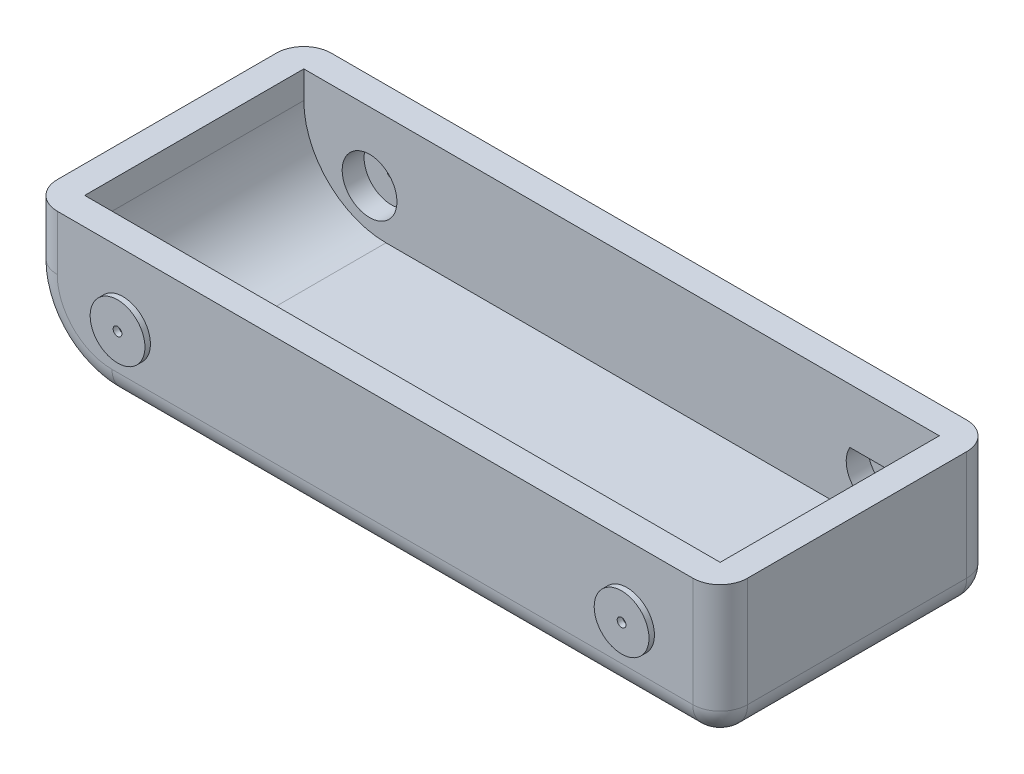
ISO-10303-21;
HEADER;
FILE_DESCRIPTION(('STEP AP214'),'2;1');
FILE_NAME('part.step','',(''),(''),'','','');
FILE_SCHEMA(('AUTOMOTIVE_DESIGN { 1 0 10303 214 1 1 1 1 }'));
ENDSEC;
DATA;
#1=APPLICATION_CONTEXT('core data for automotive mechanical design processes');
#2=APPLICATION_PROTOCOL_DEFINITION('international standard','automotive_design',2000,#1);
#3=PRODUCT_CONTEXT('',#1,'mechanical');
#4=PRODUCT('Part','Part','',(#3));
#5=PRODUCT_RELATED_PRODUCT_CATEGORY('part','',(#4));
#6=PRODUCT_DEFINITION_FORMATION('','',#4);
#7=PRODUCT_DEFINITION_CONTEXT('part definition',#1,'design');
#8=PRODUCT_DEFINITION('design','',#6,#7);
#9=PRODUCT_DEFINITION_SHAPE('','',#8);
#10=(LENGTH_UNIT() NAMED_UNIT(*) SI_UNIT(.MILLI.,.METRE.));
#11=(NAMED_UNIT(*) PLANE_ANGLE_UNIT() SI_UNIT($,.RADIAN.));
#12=(NAMED_UNIT(*) SI_UNIT($,.STERADIAN.) SOLID_ANGLE_UNIT());
#13=UNCERTAINTY_MEASURE_WITH_UNIT(LENGTH_MEASURE(1.E-05),#10,'distance_accuracy_value','');
#14=(GEOMETRIC_REPRESENTATION_CONTEXT(3) GLOBAL_UNCERTAINTY_ASSIGNED_CONTEXT((#13)) GLOBAL_UNIT_ASSIGNED_CONTEXT((#10,
#11,#12)) REPRESENTATION_CONTEXT('',''));
#15=CARTESIAN_POINT('',(0.,0.,0.));
#16=DIRECTION('',(0.,0.,1.));
#17=DIRECTION('',(1.,0.,0.));
#18=AXIS2_PLACEMENT_3D('',#15,#16,#17);
#19=CARTESIAN_POINT('',(0.,25.,0.));
#20=DIRECTION('',(1.,0.,0.));
#21=DIRECTION('',(0.,0.,-1.));
#22=AXIS2_PLACEMENT_3D('',#19,#20,#21);
#23=PLANE('',#22);
#24=DIRECTION('',(0.,0.,1.));
#25=VECTOR('',#24,1.);
#26=CARTESIAN_POINT('',(0.,15.,0.));
#27=LINE('',#26,#25);
#28=CARTESIAN_POINT('',(0.,15.,-45.));
#29=VERTEX_POINT('',#28);
#30=CARTESIAN_POINT('',(0.,15.,-5.));
#31=VERTEX_POINT('',#30);
#32=EDGE_CURVE('E274',#29,#31,#27,.T.);
#33=ORIENTED_EDGE('',*,*,#32,.T.);
#34=DIRECTION('',(0.,-1.,0.));
#35=VECTOR('',#34,1.);
#36=CARTESIAN_POINT('',(0.,25.,-5.));
#37=LINE('',#36,#35);
#38=CARTESIAN_POINT('',(0.,25.,-5.));
#39=VERTEX_POINT('',#38);
#40=EDGE_CURVE('E229',#31,#39,#37,.F.);
#41=ORIENTED_EDGE('',*,*,#40,.T.);
#42=DIRECTION('',(0.,0.,1.));
#43=VECTOR('',#42,1.);
#44=CARTESIAN_POINT('',(0.,25.,0.));
#45=LINE('',#44,#43);
#46=CARTESIAN_POINT('',(0.,25.,-45.));
#47=VERTEX_POINT('',#46);
#48=EDGE_CURVE('E282',#47,#39,#45,.T.);
#49=ORIENTED_EDGE('',*,*,#48,.F.);
#50=DIRECTION('',(0.,-1.,0.));
#51=VECTOR('',#50,1.);
#52=CARTESIAN_POINT('',(0.,25.,-45.));
#53=LINE('',#52,#51);
#54=EDGE_CURVE('E224',#47,#29,#53,.T.);
#55=ORIENTED_EDGE('',*,*,#54,.T.);
#56=EDGE_LOOP('',(#33,#41,#49,#55));
#57=FACE_BOUND('',#56,.T.);
#58=ADVANCED_FACE('F48',(#57),#23,.F.);
#59=CARTESIAN_POINT('',(0.,25.,0.));
#60=DIRECTION('',(0.,0.,-1.));
#61=DIRECTION('',(-1.,0.,0.));
#62=AXIS2_PLACEMENT_3D('',#59,#60,#61);
#63=PLANE('',#62);
#64=CARTESIAN_POINT('',(109.,12.5,0.));
#65=DIRECTION('',(0.,0.,-1.));
#66=DIRECTION('',(-1.,0.,0.));
#67=AXIS2_PLACEMENT_3D('',#64,#65,#66);
#68=CIRCLE('',#67,5.);
#69=CARTESIAN_POINT('',(104.,12.5,0.));
#70=VERTEX_POINT('',#69);
#71=EDGE_CURVE('E52',#70,#70,#68,.F.);
#72=ORIENTED_EDGE('',*,*,#71,.F.);
#73=EDGE_LOOP('',(#72));
#74=FACE_BOUND('',#73,.T.);
#75=CARTESIAN_POINT('',(17.,12.5,0.));
#76=DIRECTION('',(0.,0.,-1.));
#77=DIRECTION('',(-1.,0.,0.));
#78=AXIS2_PLACEMENT_3D('',#75,#76,#77);
#79=CIRCLE('',#78,5.);
#80=CARTESIAN_POINT('',(12.,12.5,0.));
#81=VERTEX_POINT('',#80);
#82=EDGE_CURVE('E58',#81,#81,#79,.F.);
#83=ORIENTED_EDGE('',*,*,#82,.F.);
#84=EDGE_LOOP('',(#83));
#85=FACE_BOUND('',#84,.T.);
#86=DIRECTION('',(1.,0.,0.));
#87=VECTOR('',#86,1.);
#88=CARTESIAN_POINT('',(0.,25.,0.));
#89=LINE('',#88,#87);
#90=CARTESIAN_POINT('',(5.,25.,0.));
#91=VERTEX_POINT('',#90);
#92=CARTESIAN_POINT('',(121.,25.,0.));
#93=VERTEX_POINT('',#92);
#94=EDGE_CURVE('E211',#91,#93,#89,.T.);
#95=ORIENTED_EDGE('',*,*,#94,.F.);
#96=DIRECTION('',(0.,-1.,0.));
#97=VECTOR('',#96,1.);
#98=CARTESIAN_POINT('',(5.,25.,0.));
#99=LINE('',#98,#97);
#100=CARTESIAN_POINT('',(5.,15.,0.));
#101=VERTEX_POINT('',#100);
#102=EDGE_CURVE('E212',#91,#101,#99,.T.);
#103=ORIENTED_EDGE('',*,*,#102,.T.);
#104=CARTESIAN_POINT('',(15.,15.,0.));
#105=DIRECTION('',(0.,0.,-1.));
#106=DIRECTION('',(-1.,0.,0.));
#107=AXIS2_PLACEMENT_3D('',#104,#105,#106);
#108=CIRCLE('',#107,10.);
#109=CARTESIAN_POINT('',(15.,5.,0.));
#110=VERTEX_POINT('',#109);
#111=EDGE_CURVE('E223',#101,#110,#108,.F.);
#112=ORIENTED_EDGE('',*,*,#111,.T.);
#113=DIRECTION('',(1.,0.,0.));
#114=VECTOR('',#113,1.);
#115=CARTESIAN_POINT('',(121.,5.,0.));
#116=LINE('',#115,#114);
#117=CARTESIAN_POINT('',(121.,5.,0.));
#118=VERTEX_POINT('',#117);
#119=EDGE_CURVE('E226',#110,#118,#116,.T.);
#120=ORIENTED_EDGE('',*,*,#119,.T.);
#121=DIRECTION('',(0.,-1.,0.));
#122=VECTOR('',#121,1.);
#123=CARTESIAN_POINT('',(121.,25.,0.));
#124=LINE('',#123,#122);
#125=EDGE_CURVE('E214',#118,#93,#124,.F.);
#126=ORIENTED_EDGE('',*,*,#125,.T.);
#127=EDGE_LOOP('',(#95,#103,#112,#120,#126));
#128=FACE_BOUND('',#127,.T.);
#129=ADVANCED_FACE('F202',(#74,#85,#128),#63,.F.);
#130=CARTESIAN_POINT('',(126.,25.,0.));
#131=DIRECTION('',(-1.,0.,0.));
#132=DIRECTION('',(0.,0.,1.));
#133=AXIS2_PLACEMENT_3D('',#130,#131,#132);
#134=PLANE('',#133);
#135=DIRECTION('',(0.,-1.,0.));
#136=VECTOR('',#135,1.);
#137=CARTESIAN_POINT('',(126.,25.,-5.));
#138=LINE('',#137,#136);
#139=CARTESIAN_POINT('',(126.,25.,-5.));
#140=VERTEX_POINT('',#139);
#141=CARTESIAN_POINT('',(126.,5.,-5.));
#142=VERTEX_POINT('',#141);
#143=EDGE_CURVE('E235',#140,#142,#138,.T.);
#144=ORIENTED_EDGE('',*,*,#143,.T.);
#145=DIRECTION('',(0.,0.,-1.));
#146=VECTOR('',#145,1.);
#147=CARTESIAN_POINT('',(126.,5.,-45.));
#148=LINE('',#147,#146);
#149=CARTESIAN_POINT('',(126.,5.,-45.));
#150=VERTEX_POINT('',#149);
#151=EDGE_CURVE('E244',#142,#150,#148,.T.);
#152=ORIENTED_EDGE('',*,*,#151,.T.);
#153=DIRECTION('',(0.,-1.,0.));
#154=VECTOR('',#153,1.);
#155=CARTESIAN_POINT('',(126.,25.,-45.));
#156=LINE('',#155,#154);
#157=CARTESIAN_POINT('',(126.,25.,-45.));
#158=VERTEX_POINT('',#157);
#159=EDGE_CURVE('E241',#150,#158,#156,.F.);
#160=ORIENTED_EDGE('',*,*,#159,.T.);
#161=DIRECTION('',(0.,0.,-1.));
#162=VECTOR('',#161,1.);
#163=CARTESIAN_POINT('',(126.,25.,0.));
#164=LINE('',#163,#162);
#165=EDGE_CURVE('E239',#140,#158,#164,.T.);
#166=ORIENTED_EDGE('',*,*,#165,.F.);
#167=EDGE_LOOP('',(#144,#152,#160,#166));
#168=FACE_BOUND('',#167,.T.);
#169=ADVANCED_FACE('F205',(#168),#134,.F.);
#170=CARTESIAN_POINT('',(0.,25.,-50.));
#171=DIRECTION('',(0.,0.,1.));
#172=DIRECTION('',(1.,0.,0.));
#173=AXIS2_PLACEMENT_3D('',#170,#171,#172);
#174=PLANE('',#173);
#175=CARTESIAN_POINT('',(17.,12.5,-50.));
#176=DIRECTION('',(0.,0.,1.));
#177=DIRECTION('',(1.,0.,0.));
#178=AXIS2_PLACEMENT_3D('',#175,#176,#177);
#179=CIRCLE('',#178,5.);
#180=CARTESIAN_POINT('',(22.,12.5,-50.));
#181=VERTEX_POINT('',#180);
#182=EDGE_CURVE('E178',#181,#181,#179,.F.);
#183=ORIENTED_EDGE('',*,*,#182,.F.);
#184=EDGE_LOOP('',(#183));
#185=FACE_BOUND('',#184,.T.);
#186=CARTESIAN_POINT('',(109.,12.5,-50.));
#187=DIRECTION('',(0.,0.,1.));
#188=DIRECTION('',(1.,0.,0.));
#189=AXIS2_PLACEMENT_3D('',#186,#187,#188);
#190=CIRCLE('',#189,5.);
#191=CARTESIAN_POINT('',(114.,12.5,-50.));
#192=VERTEX_POINT('',#191);
#193=EDGE_CURVE('E166',#192,#192,#190,.F.);
#194=ORIENTED_EDGE('',*,*,#193,.F.);
#195=EDGE_LOOP('',(#194));
#196=FACE_BOUND('',#195,.T.);
#197=CARTESIAN_POINT('',(15.,15.,-50.));
#198=DIRECTION('',(0.,0.,1.));
#199=DIRECTION('',(1.,0.,0.));
#200=AXIS2_PLACEMENT_3D('',#197,#198,#199);
#201=CIRCLE('',#200,10.);
#202=CARTESIAN_POINT('',(15.,5.,-50.));
#203=VERTEX_POINT('',#202);
#204=CARTESIAN_POINT('',(5.,15.,-50.));
#205=VERTEX_POINT('',#204);
#206=EDGE_CURVE('E243',#203,#205,#201,.F.);
#207=ORIENTED_EDGE('',*,*,#206,.T.);
#208=DIRECTION('',(0.,-1.,0.));
#209=VECTOR('',#208,1.);
#210=CARTESIAN_POINT('',(5.,25.,-50.));
#211=LINE('',#210,#209);
#212=CARTESIAN_POINT('',(5.,25.,-50.));
#213=VERTEX_POINT('',#212);
#214=EDGE_CURVE('E251',#205,#213,#211,.F.);
#215=ORIENTED_EDGE('',*,*,#214,.T.);
#216=DIRECTION('',(-1.,0.,0.));
#217=VECTOR('',#216,1.);
#218=CARTESIAN_POINT('',(0.,25.,-50.));
#219=LINE('',#218,#217);
#220=CARTESIAN_POINT('',(121.,25.,-50.));
#221=VERTEX_POINT('',#220);
#222=EDGE_CURVE('E238',#221,#213,#219,.T.);
#223=ORIENTED_EDGE('',*,*,#222,.F.);
#224=DIRECTION('',(0.,-1.,0.));
#225=VECTOR('',#224,1.);
#226=CARTESIAN_POINT('',(121.,25.,-50.));
#227=LINE('',#226,#225);
#228=CARTESIAN_POINT('',(121.,5.,-50.));
#229=VERTEX_POINT('',#228);
#230=EDGE_CURVE('E247',#221,#229,#227,.T.);
#231=ORIENTED_EDGE('',*,*,#230,.T.);
#232=DIRECTION('',(-1.,0.,0.));
#233=VECTOR('',#232,1.);
#234=CARTESIAN_POINT('',(15.,5.,-50.));
#235=LINE('',#234,#233);
#236=EDGE_CURVE('E250',#229,#203,#235,.T.);
#237=ORIENTED_EDGE('',*,*,#236,.T.);
#238=EDGE_LOOP('',(#207,#215,#223,#231,#237));
#239=FACE_BOUND('',#238,.T.);
#240=ADVANCED_FACE('F367',(#185,#196,#239),#174,.F.);
#241=CARTESIAN_POINT('',(0.,25.,0.));
#242=DIRECTION('',(0.,-1.,0.));
#243=DIRECTION('',(0.,0.,-1.));
#244=AXIS2_PLACEMENT_3D('',#241,#242,#243);
#245=PLANE('',#244);
#246=DIRECTION('',(1.,0.,0.));
#247=VECTOR('',#246,1.);
#248=CARTESIAN_POINT('',(5.00000000000001,25.,-5.));
#249=LINE('',#248,#247);
#250=CARTESIAN_POINT('',(5.00000000000001,25.,-5.));
#251=VERTEX_POINT('',#250);
#252=CARTESIAN_POINT('',(121.,25.,-5.));
#253=VERTEX_POINT('',#252);
#254=EDGE_CURVE('E286',#251,#253,#249,.T.);
#255=ORIENTED_EDGE('',*,*,#254,.F.);
#256=DIRECTION('',(0.,0.,1.));
#257=VECTOR('',#256,1.);
#258=CARTESIAN_POINT('',(5.,25.,-45.));
#259=LINE('',#258,#257);
#260=CARTESIAN_POINT('',(5.,25.,-45.));
#261=VERTEX_POINT('',#260);
#262=EDGE_CURVE('E292',#261,#251,#259,.T.);
#263=ORIENTED_EDGE('',*,*,#262,.F.);
#264=DIRECTION('',(-1.,0.,0.));
#265=VECTOR('',#264,1.);
#266=CARTESIAN_POINT('',(5.,25.,-45.));
#267=LINE('',#266,#265);
#268=CARTESIAN_POINT('',(121.,25.,-45.));
#269=VERTEX_POINT('',#268);
#270=EDGE_CURVE('E290',#269,#261,#267,.T.);
#271=ORIENTED_EDGE('',*,*,#270,.F.);
#272=DIRECTION('',(0.,0.,-1.));
#273=VECTOR('',#272,1.);
#274=CARTESIAN_POINT('',(121.,25.,-45.));
#275=LINE('',#274,#273);
#276=EDGE_CURVE('E288',#253,#269,#275,.T.);
#277=ORIENTED_EDGE('',*,*,#276,.F.);
#278=EDGE_LOOP('',(#255,#263,#271,#277));
#279=FACE_BOUND('',#278,.T.);
#280=ORIENTED_EDGE('',*,*,#48,.T.);
#281=CARTESIAN_POINT('',(5.,25.,-5.));
#282=DIRECTION('',(0.,-1.,0.));
#283=DIRECTION('',(0.,0.,-1.));
#284=AXIS2_PLACEMENT_3D('',#281,#282,#283);
#285=CIRCLE('',#284,5.);
#286=EDGE_CURVE('E218',#39,#91,#285,.F.);
#287=ORIENTED_EDGE('',*,*,#286,.T.);
#288=ORIENTED_EDGE('',*,*,#94,.T.);
#289=CARTESIAN_POINT('',(121.,25.,-5.));
#290=DIRECTION('',(0.,-1.,0.));
#291=DIRECTION('',(0.,0.,-1.));
#292=AXIS2_PLACEMENT_3D('',#289,#290,#291);
#293=CIRCLE('',#292,5.);
#294=EDGE_CURVE('E217',#93,#140,#293,.F.);
#295=ORIENTED_EDGE('',*,*,#294,.T.);
#296=ORIENTED_EDGE('',*,*,#165,.T.);
#297=CARTESIAN_POINT('',(121.,25.,-45.));
#298=DIRECTION('',(0.,-1.,0.));
#299=DIRECTION('',(0.,0.,-1.));
#300=AXIS2_PLACEMENT_3D('',#297,#298,#299);
#301=CIRCLE('',#300,5.);
#302=EDGE_CURVE('E236',#158,#221,#301,.F.);
#303=ORIENTED_EDGE('',*,*,#302,.T.);
#304=ORIENTED_EDGE('',*,*,#222,.T.);
#305=CARTESIAN_POINT('',(5.,25.,-45.));
#306=DIRECTION('',(0.,-1.,0.));
#307=DIRECTION('',(0.,0.,-1.));
#308=AXIS2_PLACEMENT_3D('',#305,#306,#307);
#309=CIRCLE('',#308,5.);
#310=EDGE_CURVE('E279',#213,#47,#309,.F.);
#311=ORIENTED_EDGE('',*,*,#310,.T.);
#312=EDGE_LOOP('',(#280,#287,#288,#295,#296,#303,#304,#311));
#313=FACE_BOUND('',#312,.T.);
#314=ADVANCED_FACE('F345',(#279,#313),#245,.F.);
#315=CARTESIAN_POINT('',(0.,0.,0.));
#316=DIRECTION('',(0.,-1.,0.));
#317=DIRECTION('',(0.,0.,-1.));
#318=AXIS2_PLACEMENT_3D('',#315,#316,#317);
#319=PLANE('',#318);
#320=DIRECTION('',(0.,0.,-1.));
#321=VECTOR('',#320,1.);
#322=CARTESIAN_POINT('',(121.,0.,-5.));
#323=LINE('',#322,#321);
#324=CARTESIAN_POINT('',(121.,0.,-45.));
#325=VERTEX_POINT('',#324);
#326=CARTESIAN_POINT('',(121.,0.,-5.));
#327=VERTEX_POINT('',#326);
#328=EDGE_CURVE('E692',#325,#327,#323,.F.);
#329=ORIENTED_EDGE('',*,*,#328,.T.);
#330=DIRECTION('',(1.,0.,0.));
#331=VECTOR('',#330,1.);
#332=CARTESIAN_POINT('',(15.,0.,-5.));
#333=LINE('',#332,#331);
#334=CARTESIAN_POINT('',(15.,0.,-5.));
#335=VERTEX_POINT('',#334);
#336=EDGE_CURVE('E273',#327,#335,#333,.F.);
#337=ORIENTED_EDGE('',*,*,#336,.T.);
#338=DIRECTION('',(0.,0.,1.));
#339=VECTOR('',#338,1.);
#340=CARTESIAN_POINT('',(15.,0.,-50.));
#341=LINE('',#340,#339);
#342=CARTESIAN_POINT('',(15.,0.,-45.));
#343=VERTEX_POINT('',#342);
#344=EDGE_CURVE('E270',#335,#343,#341,.F.);
#345=ORIENTED_EDGE('',*,*,#344,.T.);
#346=DIRECTION('',(-1.,0.,0.));
#347=VECTOR('',#346,1.);
#348=CARTESIAN_POINT('',(121.,0.,-45.));
#349=LINE('',#348,#347);
#350=EDGE_CURVE('E260',#343,#325,#349,.F.);
#351=ORIENTED_EDGE('',*,*,#350,.T.);
#352=EDGE_LOOP('',(#329,#337,#345,#351));
#353=FACE_BOUND('',#352,.T.);
#354=ADVANCED_FACE('F347',(#353),#319,.T.);
#355=CARTESIAN_POINT('',(5.,5.,-45.));
#356=DIRECTION('',(-1.,0.,0.));
#357=DIRECTION('',(0.,0.,1.));
#358=AXIS2_PLACEMENT_3D('',#355,#356,#357);
#359=PLANE('',#358);
#360=DIRECTION('',(0.,1.,0.));
#361=VECTOR('',#360,1.);
#362=CARTESIAN_POINT('',(5.00000000000001,5.,-5.));
#363=LINE('',#362,#361);
#364=CARTESIAN_POINT('',(5.00000000000001,20.,-5.));
#365=VERTEX_POINT('',#364);
#366=EDGE_CURVE('E263',#365,#251,#363,.T.);
#367=ORIENTED_EDGE('',*,*,#366,.F.);
#368=DIRECTION('',(0.,0.,1.));
#369=VECTOR('',#368,1.);
#370=CARTESIAN_POINT('',(5.,20.,-45.));
#371=LINE('',#370,#369);
#372=CARTESIAN_POINT('',(5.,20.,-45.));
#373=VERTEX_POINT('',#372);
#374=EDGE_CURVE('E257',#365,#373,#371,.F.);
#375=ORIENTED_EDGE('',*,*,#374,.T.);
#376=DIRECTION('',(0.,1.,0.));
#377=VECTOR('',#376,1.);
#378=CARTESIAN_POINT('',(5.,5.,-45.));
#379=LINE('',#378,#377);
#380=EDGE_CURVE('E259',#373,#261,#379,.T.);
#381=ORIENTED_EDGE('',*,*,#380,.T.);
#382=ORIENTED_EDGE('',*,*,#262,.T.);
#383=EDGE_LOOP('',(#367,#375,#381,#382));
#384=FACE_BOUND('',#383,.T.);
#385=ADVANCED_FACE('F319',(#384),#359,.F.);
#386=CARTESIAN_POINT('',(5.,5.,-45.));
#387=DIRECTION('',(0.,0.,-1.));
#388=DIRECTION('',(-1.,0.,0.));
#389=AXIS2_PLACEMENT_3D('',#386,#387,#388);
#390=PLANE('',#389);
#391=CARTESIAN_POINT('',(109.,12.5,-45.));
#392=DIRECTION('',(0.,0.,-1.));
#393=DIRECTION('',(-1.,0.,0.));
#394=AXIS2_PLACEMENT_3D('',#391,#392,#393);
#395=CIRCLE('',#394,5.);
#396=CARTESIAN_POINT('',(113.330127018922,15.,-45.));
#397=VERTEX_POINT('',#396);
#398=CARTESIAN_POINT('',(104.669872981078,15.,-45.));
#399=VERTEX_POINT('',#398);
#400=EDGE_CURVE('E153',#397,#399,#395,.T.);
#401=ORIENTED_EDGE('',*,*,#400,.T.);
#402=DIRECTION('',(-1.,0.,0.));
#403=VECTOR('',#402,1.);
#404=CARTESIAN_POINT('',(0.,15.,-45.));
#405=LINE('',#404,#403);
#406=EDGE_CURVE('E157',#397,#399,#405,.T.);
#407=ORIENTED_EDGE('',*,*,#406,.F.);
#408=EDGE_LOOP('',(#401,#407));
#409=FACE_BOUND('',#408,.T.);
#410=CARTESIAN_POINT('',(17.,12.5,-45.));
#411=DIRECTION('',(0.,0.,-1.));
#412=DIRECTION('',(-1.,0.,0.));
#413=AXIS2_PLACEMENT_3D('',#410,#411,#412);
#414=CIRCLE('',#413,5.);
#415=CARTESIAN_POINT('',(12.,12.5,-45.));
#416=VERTEX_POINT('',#415);
#417=EDGE_CURVE('E187',#416,#416,#414,.F.);
#418=ORIENTED_EDGE('',*,*,#417,.F.);
#419=EDGE_LOOP('',(#418));
#420=FACE_BOUND('',#419,.T.);
#421=ORIENTED_EDGE('',*,*,#380,.F.);
#422=CARTESIAN_POINT('',(20.,20.,-45.));
#423=DIRECTION('',(0.,0.,-1.));
#424=DIRECTION('',(-1.,0.,0.));
#425=AXIS2_PLACEMENT_3D('',#422,#423,#424);
#426=CIRCLE('',#425,15.);
#427=CARTESIAN_POINT('',(20.,5.,-45.));
#428=VERTEX_POINT('',#427);
#429=EDGE_CURVE('E254',#373,#428,#426,.F.);
#430=ORIENTED_EDGE('',*,*,#429,.T.);
#431=DIRECTION('',(-1.,0.,0.));
#432=VECTOR('',#431,1.);
#433=CARTESIAN_POINT('',(5.,5.,-45.));
#434=LINE('',#433,#432);
#435=CARTESIAN_POINT('',(121.,5.,-45.));
#436=VERTEX_POINT('',#435);
#437=EDGE_CURVE('E269',#436,#428,#434,.T.);
#438=ORIENTED_EDGE('',*,*,#437,.F.);
#439=DIRECTION('',(0.,1.,0.));
#440=VECTOR('',#439,1.);
#441=CARTESIAN_POINT('',(121.,5.,-45.));
#442=LINE('',#441,#440);
#443=EDGE_CURVE('E256',#436,#269,#442,.T.);
#444=ORIENTED_EDGE('',*,*,#443,.T.);
#445=ORIENTED_EDGE('',*,*,#270,.T.);
#446=EDGE_LOOP('',(#421,#430,#438,#444,#445));
#447=FACE_BOUND('',#446,.T.);
#448=ADVANCED_FACE('F315',(#409,#420,#447),#390,.F.);
#449=CARTESIAN_POINT('',(121.,5.,-45.));
#450=DIRECTION('',(1.,0.,0.));
#451=DIRECTION('',(0.,0.,-1.));
#452=AXIS2_PLACEMENT_3D('',#449,#450,#451);
#453=PLANE('',#452);
#454=ORIENTED_EDGE('',*,*,#276,.T.);
#455=ORIENTED_EDGE('',*,*,#443,.F.);
#456=DIRECTION('',(0.,0.,-1.));
#457=VECTOR('',#456,1.);
#458=CARTESIAN_POINT('',(121.,5.,-45.));
#459=LINE('',#458,#457);
#460=CARTESIAN_POINT('',(121.,5.,-5.));
#461=VERTEX_POINT('',#460);
#462=EDGE_CURVE('E303',#461,#436,#459,.T.);
#463=ORIENTED_EDGE('',*,*,#462,.F.);
#464=DIRECTION('',(0.,1.,0.));
#465=VECTOR('',#464,1.);
#466=CARTESIAN_POINT('',(121.,5.,-5.));
#467=LINE('',#466,#465);
#468=EDGE_CURVE('E264',#461,#253,#467,.T.);
#469=ORIENTED_EDGE('',*,*,#468,.T.);
#470=EDGE_LOOP('',(#454,#455,#463,#469));
#471=FACE_BOUND('',#470,.T.);
#472=ADVANCED_FACE('F318',(#471),#453,.F.);
#473=CARTESIAN_POINT('',(5.00000000000001,5.,-5.));
#474=DIRECTION('',(0.,0.,1.));
#475=DIRECTION('',(1.,0.,0.));
#476=AXIS2_PLACEMENT_3D('',#473,#474,#475);
#477=PLANE('',#476);
#478=CARTESIAN_POINT('',(109.,12.5,-5.));
#479=DIRECTION('',(0.,0.,-1.));
#480=DIRECTION('',(-1.,0.,0.));
#481=AXIS2_PLACEMENT_3D('',#478,#479,#480);
#482=CIRCLE('',#481,5.);
#483=CARTESIAN_POINT('',(104.,12.5,-5.));
#484=VERTEX_POINT('',#483);
#485=EDGE_CURVE('E194',#484,#484,#482,.T.);
#486=ORIENTED_EDGE('',*,*,#485,.F.);
#487=EDGE_LOOP('',(#486));
#488=FACE_BOUND('',#487,.T.);
#489=CARTESIAN_POINT('',(17.,12.5,-5.));
#490=DIRECTION('',(0.,0.,-1.));
#491=DIRECTION('',(-1.,0.,0.));
#492=AXIS2_PLACEMENT_3D('',#489,#490,#491);
#493=CIRCLE('',#492,5.);
#494=CARTESIAN_POINT('',(12.,12.5,-5.));
#495=VERTEX_POINT('',#494);
#496=EDGE_CURVE('E12',#495,#495,#493,.T.);
#497=ORIENTED_EDGE('',*,*,#496,.F.);
#498=EDGE_LOOP('',(#497));
#499=FACE_BOUND('',#498,.T.);
#500=DIRECTION('',(1.,0.,0.));
#501=VECTOR('',#500,1.);
#502=CARTESIAN_POINT('',(5.00000000000001,5.,-5.));
#503=LINE('',#502,#501);
#504=CARTESIAN_POINT('',(20.,5.,-5.));
#505=VERTEX_POINT('',#504);
#506=EDGE_CURVE('E268',#505,#461,#503,.T.);
#507=ORIENTED_EDGE('',*,*,#506,.F.);
#508=CARTESIAN_POINT('',(20.,20.,-5.));
#509=DIRECTION('',(0.,0.,1.));
#510=DIRECTION('',(1.,0.,0.));
#511=AXIS2_PLACEMENT_3D('',#508,#509,#510);
#512=CIRCLE('',#511,15.);
#513=EDGE_CURVE('E261',#505,#365,#512,.F.);
#514=ORIENTED_EDGE('',*,*,#513,.T.);
#515=ORIENTED_EDGE('',*,*,#366,.T.);
#516=ORIENTED_EDGE('',*,*,#254,.T.);
#517=ORIENTED_EDGE('',*,*,#468,.F.);
#518=EDGE_LOOP('',(#507,#514,#515,#516,#517));
#519=FACE_BOUND('',#518,.T.);
#520=ADVANCED_FACE('F338',(#488,#499,#519),#477,.F.);
#521=CARTESIAN_POINT('',(0.,5.,0.));
#522=DIRECTION('',(0.,1.,0.));
#523=DIRECTION('',(0.,0.,1.));
#524=AXIS2_PLACEMENT_3D('',#521,#522,#523);
#525=PLANE('',#524);
#526=ORIENTED_EDGE('',*,*,#437,.T.);
#527=DIRECTION('',(0.,0.,1.));
#528=VECTOR('',#527,1.);
#529=CARTESIAN_POINT('',(20.,5.,0.));
#530=LINE('',#529,#528);
#531=EDGE_CURVE('E265',#428,#505,#530,.T.);
#532=ORIENTED_EDGE('',*,*,#531,.T.);
#533=ORIENTED_EDGE('',*,*,#506,.T.);
#534=ORIENTED_EDGE('',*,*,#462,.T.);
#535=EDGE_LOOP('',(#526,#532,#533,#534));
#536=FACE_BOUND('',#535,.T.);
#537=ADVANCED_FACE('F335',(#536),#525,.T.);
#538=CARTESIAN_POINT('',(15.,15.,0.));
#539=DIRECTION('',(0.,0.,-1.));
#540=DIRECTION('',(-1.,0.,0.));
#541=AXIS2_PLACEMENT_3D('',#538,#539,#540);
#542=CYLINDRICAL_SURFACE('',#541,15.);
#543=ORIENTED_EDGE('',*,*,#344,.F.);
#544=CARTESIAN_POINT('',(15.,15.,-5.));
#545=DIRECTION('',(0.,0.,-1.));
#546=DIRECTION('',(-1.,0.,0.));
#547=AXIS2_PLACEMENT_3D('',#544,#545,#546);
#548=CIRCLE('',#547,15.);
#549=EDGE_CURVE('E306',#335,#31,#548,.T.);
#550=ORIENTED_EDGE('',*,*,#549,.T.);
#551=ORIENTED_EDGE('',*,*,#32,.F.);
#552=CARTESIAN_POINT('',(15.,15.,-45.));
#553=DIRECTION('',(0.,0.,1.));
#554=DIRECTION('',(1.,0.,0.));
#555=AXIS2_PLACEMENT_3D('',#552,#553,#554);
#556=CIRCLE('',#555,15.);
#557=EDGE_CURVE('E310',#29,#343,#556,.T.);
#558=ORIENTED_EDGE('',*,*,#557,.T.);
#559=EDGE_LOOP('',(#543,#550,#551,#558));
#560=FACE_BOUND('',#559,.T.);
#561=ADVANCED_FACE('F362',(#560),#542,.T.);
#562=CARTESIAN_POINT('',(20.,20.,0.));
#563=DIRECTION('',(0.,0.,1.));
#564=DIRECTION('',(1.,0.,0.));
#565=AXIS2_PLACEMENT_3D('',#562,#563,#564);
#566=CYLINDRICAL_SURFACE('',#565,15.);
#567=ORIENTED_EDGE('',*,*,#429,.F.);
#568=ORIENTED_EDGE('',*,*,#374,.F.);
#569=ORIENTED_EDGE('',*,*,#513,.F.);
#570=ORIENTED_EDGE('',*,*,#531,.F.);
#571=EDGE_LOOP('',(#567,#568,#569,#570));
#572=FACE_BOUND('',#571,.T.);
#573=ADVANCED_FACE('F332',(#572),#566,.F.);
#574=CARTESIAN_POINT('',(17.,12.5,-49.));
#575=DIRECTION('',(0.,0.,1.));
#576=DIRECTION('',(1.,0.,0.));
#577=AXIS2_PLACEMENT_3D('',#574,#575,#576);
#578=CYLINDRICAL_SURFACE('',#577,5.);
#579=CARTESIAN_POINT('',(17.,12.5,-49.));
#580=DIRECTION('',(0.,0.,-1.));
#581=DIRECTION('',(-1.,0.,0.));
#582=AXIS2_PLACEMENT_3D('',#579,#580,#581);
#583=CIRCLE('',#582,5.);
#584=CARTESIAN_POINT('',(12.,12.5,-49.));
#585=VERTEX_POINT('',#584);
#586=EDGE_CURVE('E186',#585,#585,#583,.F.);
#587=ORIENTED_EDGE('',*,*,#586,.F.);
#588=EDGE_LOOP('',(#587));
#589=FACE_BOUND('',#588,.T.);
#590=ORIENTED_EDGE('',*,*,#417,.T.);
#591=EDGE_LOOP('',(#590));
#592=FACE_BOUND('',#591,.T.);
#593=ADVANCED_FACE('F431',(#589,#592),#578,.F.);
#594=CARTESIAN_POINT('',(0.,0.,-49.));
#595=DIRECTION('',(0.,0.,-1.));
#596=DIRECTION('',(-1.,0.,0.));
#597=AXIS2_PLACEMENT_3D('',#594,#595,#596);
#598=PLANE('',#597);
#599=CARTESIAN_POINT('',(17.,12.5,-49.));
#600=DIRECTION('',(0.,0.,-1.));
#601=DIRECTION('',(-1.,0.,0.));
#602=AXIS2_PLACEMENT_3D('',#599,#600,#601);
#603=CIRCLE('',#602,0.799999999999999);
#604=CARTESIAN_POINT('',(16.2,12.5,-49.));
#605=VERTEX_POINT('',#604);
#606=EDGE_CURVE('E183',#605,#605,#603,.T.);
#607=ORIENTED_EDGE('',*,*,#606,.T.);
#608=EDGE_LOOP('',(#607));
#609=FACE_BOUND('',#608,.T.);
#610=ORIENTED_EDGE('',*,*,#586,.T.);
#611=EDGE_LOOP('',(#610));
#612=FACE_BOUND('',#611,.T.);
#613=ADVANCED_FACE('F439',(#609,#612),#598,.F.);
#614=CARTESIAN_POINT('',(0.,15.,-49.));
#615=DIRECTION('',(0.,1.,0.));
#616=DIRECTION('',(-1.,0.,0.));
#617=AXIS2_PLACEMENT_3D('',#614,#615,#616);
#618=PLANE('',#617);
#619=ORIENTED_EDGE('',*,*,#406,.T.);
#620=DIRECTION('',(0.,0.,1.));
#621=VECTOR('',#620,1.);
#622=CARTESIAN_POINT('',(104.669872981078,15.,-49.));
#623=LINE('',#622,#621);
#624=CARTESIAN_POINT('',(104.669872981078,15.,-49.));
#625=VERTEX_POINT('',#624);
#626=EDGE_CURVE('E163',#625,#399,#623,.T.);
#627=ORIENTED_EDGE('',*,*,#626,.F.);
#628=DIRECTION('',(-1.,0.,0.));
#629=VECTOR('',#628,1.);
#630=CARTESIAN_POINT('',(0.,15.,-49.));
#631=LINE('',#630,#629);
#632=CARTESIAN_POINT('',(113.330127018922,15.,-49.));
#633=VERTEX_POINT('',#632);
#634=EDGE_CURVE('E162',#633,#625,#631,.T.);
#635=ORIENTED_EDGE('',*,*,#634,.F.);
#636=DIRECTION('',(0.,0.,1.));
#637=VECTOR('',#636,1.);
#638=CARTESIAN_POINT('',(113.330127018922,15.,-49.));
#639=LINE('',#638,#637);
#640=EDGE_CURVE('E150',#633,#397,#639,.T.);
#641=ORIENTED_EDGE('',*,*,#640,.T.);
#642=EDGE_LOOP('',(#619,#627,#635,#641));
#643=FACE_BOUND('',#642,.T.);
#644=ADVANCED_FACE('F165',(#643),#618,.F.);
#645=CARTESIAN_POINT('',(109.,12.5,-49.));
#646=DIRECTION('',(0.,0.,1.));
#647=DIRECTION('',(1.,0.,0.));
#648=AXIS2_PLACEMENT_3D('',#645,#646,#647);
#649=CYLINDRICAL_SURFACE('',#648,5.);
#650=ORIENTED_EDGE('',*,*,#400,.F.);
#651=ORIENTED_EDGE('',*,*,#640,.F.);
#652=CARTESIAN_POINT('',(109.,12.5,-49.));
#653=DIRECTION('',(0.,0.,-1.));
#654=DIRECTION('',(-1.,0.,0.));
#655=AXIS2_PLACEMENT_3D('',#652,#653,#654);
#656=CIRCLE('',#655,5.);
#657=EDGE_CURVE('E145',#633,#625,#656,.T.);
#658=ORIENTED_EDGE('',*,*,#657,.T.);
#659=ORIENTED_EDGE('',*,*,#626,.T.);
#660=EDGE_LOOP('',(#650,#651,#658,#659));
#661=FACE_BOUND('',#660,.T.);
#662=ADVANCED_FACE('F151',(#661),#649,.F.);
#663=CARTESIAN_POINT('',(0.,0.,-49.));
#664=DIRECTION('',(0.,0.,-1.));
#665=DIRECTION('',(-1.,0.,0.));
#666=AXIS2_PLACEMENT_3D('',#663,#664,#665);
#667=PLANE('',#666);
#668=CARTESIAN_POINT('',(109.,12.5,-49.));
#669=DIRECTION('',(0.,0.,-1.));
#670=DIRECTION('',(-1.,0.,0.));
#671=AXIS2_PLACEMENT_3D('',#668,#669,#670);
#672=CIRCLE('',#671,0.799999999999995);
#673=CARTESIAN_POINT('',(108.2,12.5,-49.));
#674=VERTEX_POINT('',#673);
#675=EDGE_CURVE('E167',#674,#674,#672,.T.);
#676=ORIENTED_EDGE('',*,*,#675,.T.);
#677=EDGE_LOOP('',(#676));
#678=FACE_BOUND('',#677,.T.);
#679=ORIENTED_EDGE('',*,*,#634,.T.);
#680=ORIENTED_EDGE('',*,*,#657,.F.);
#681=EDGE_LOOP('',(#679,#680));
#682=FACE_BOUND('',#681,.T.);
#683=ADVANCED_FACE('F161',(#678,#682),#667,.F.);
#684=CARTESIAN_POINT('',(109.,12.5,-51.));
#685=DIRECTION('',(0.,0.,1.));
#686=DIRECTION('',(1.,0.,0.));
#687=AXIS2_PLACEMENT_3D('',#684,#685,#686);
#688=CYLINDRICAL_SURFACE('',#687,5.);
#689=CARTESIAN_POINT('',(109.,12.5,-51.));
#690=DIRECTION('',(0.,0.,-1.));
#691=DIRECTION('',(-1.,0.,0.));
#692=AXIS2_PLACEMENT_3D('',#689,#690,#691);
#693=CIRCLE('',#692,5.);
#694=CARTESIAN_POINT('',(104.,12.5,-51.));
#695=VERTEX_POINT('',#694);
#696=EDGE_CURVE('E170',#695,#695,#693,.T.);
#697=ORIENTED_EDGE('',*,*,#696,.F.);
#698=EDGE_LOOP('',(#697));
#699=FACE_BOUND('',#698,.T.);
#700=ORIENTED_EDGE('',*,*,#193,.T.);
#701=EDGE_LOOP('',(#700));
#702=FACE_BOUND('',#701,.T.);
#703=ADVANCED_FACE('F474',(#699,#702),#688,.T.);
#704=CARTESIAN_POINT('',(109.,12.5,-51.));
#705=DIRECTION('',(0.,0.,-1.));
#706=DIRECTION('',(-1.,0.,0.));
#707=AXIS2_PLACEMENT_3D('',#704,#705,#706);
#708=PLANE('',#707);
#709=CARTESIAN_POINT('',(109.,12.5,-51.));
#710=DIRECTION('',(0.,0.,-1.));
#711=DIRECTION('',(-1.,0.,0.));
#712=AXIS2_PLACEMENT_3D('',#709,#710,#711);
#713=CIRCLE('',#712,0.799999999999995);
#714=CARTESIAN_POINT('',(108.2,12.5,-51.));
#715=VERTEX_POINT('',#714);
#716=EDGE_CURVE('E188',#715,#715,#713,.T.);
#717=ORIENTED_EDGE('',*,*,#716,.F.);
#718=EDGE_LOOP('',(#717));
#719=FACE_BOUND('',#718,.T.);
#720=ORIENTED_EDGE('',*,*,#696,.T.);
#721=EDGE_LOOP('',(#720));
#722=FACE_BOUND('',#721,.T.);
#723=ADVANCED_FACE('F484',(#719,#722),#708,.T.);
#724=CARTESIAN_POINT('',(17.,12.5,-51.));
#725=DIRECTION('',(0.,0.,1.));
#726=DIRECTION('',(1.,0.,0.));
#727=AXIS2_PLACEMENT_3D('',#724,#725,#726);
#728=CYLINDRICAL_SURFACE('',#727,5.);
#729=CARTESIAN_POINT('',(17.,12.5,-51.));
#730=DIRECTION('',(0.,0.,-1.));
#731=DIRECTION('',(-1.,0.,0.));
#732=AXIS2_PLACEMENT_3D('',#729,#730,#731);
#733=CIRCLE('',#732,5.);
#734=CARTESIAN_POINT('',(12.,12.5,-51.));
#735=VERTEX_POINT('',#734);
#736=EDGE_CURVE('E179',#735,#735,#733,.T.);
#737=ORIENTED_EDGE('',*,*,#736,.F.);
#738=EDGE_LOOP('',(#737));
#739=FACE_BOUND('',#738,.T.);
#740=ORIENTED_EDGE('',*,*,#182,.T.);
#741=EDGE_LOOP('',(#740));
#742=FACE_BOUND('',#741,.T.);
#743=ADVANCED_FACE('F494',(#739,#742),#728,.T.);
#744=CARTESIAN_POINT('',(17.,12.5,-51.));
#745=DIRECTION('',(0.,0.,-1.));
#746=DIRECTION('',(-1.,0.,0.));
#747=AXIS2_PLACEMENT_3D('',#744,#745,#746);
#748=PLANE('',#747);
#749=CARTESIAN_POINT('',(17.,12.5,-51.));
#750=DIRECTION('',(0.,0.,-1.));
#751=DIRECTION('',(-1.,0.,0.));
#752=AXIS2_PLACEMENT_3D('',#749,#750,#751);
#753=CIRCLE('',#752,0.799999999999999);
#754=CARTESIAN_POINT('',(16.2,12.5,-51.));
#755=VERTEX_POINT('',#754);
#756=EDGE_CURVE('E181',#755,#755,#753,.T.);
#757=ORIENTED_EDGE('',*,*,#756,.F.);
#758=EDGE_LOOP('',(#757));
#759=FACE_BOUND('',#758,.T.);
#760=ORIENTED_EDGE('',*,*,#736,.T.);
#761=EDGE_LOOP('',(#760));
#762=FACE_BOUND('',#761,.T.);
#763=ADVANCED_FACE('F504',(#759,#762),#748,.T.);
#764=CARTESIAN_POINT('',(17.,12.5,-46.));
#765=DIRECTION('',(0.,0.,-1.));
#766=DIRECTION('',(-1.,0.,0.));
#767=AXIS2_PLACEMENT_3D('',#764,#765,#766);
#768=CYLINDRICAL_SURFACE('',#767,0.799999999999999);
#769=ORIENTED_EDGE('',*,*,#756,.T.);
#770=EDGE_LOOP('',(#769));
#771=FACE_BOUND('',#770,.T.);
#772=ORIENTED_EDGE('',*,*,#606,.F.);
#773=EDGE_LOOP('',(#772));
#774=FACE_BOUND('',#773,.T.);
#775=ADVANCED_FACE('F514',(#771,#774),#768,.F.);
#776=CARTESIAN_POINT('',(109.,12.5,-46.));
#777=DIRECTION('',(0.,0.,-1.));
#778=DIRECTION('',(-1.,0.,0.));
#779=AXIS2_PLACEMENT_3D('',#776,#777,#778);
#780=CYLINDRICAL_SURFACE('',#779,0.799999999999995);
#781=ORIENTED_EDGE('',*,*,#716,.T.);
#782=EDGE_LOOP('',(#781));
#783=FACE_BOUND('',#782,.T.);
#784=ORIENTED_EDGE('',*,*,#675,.F.);
#785=EDGE_LOOP('',(#784));
#786=FACE_BOUND('',#785,.T.);
#787=ADVANCED_FACE('F524',(#783,#786),#780,.F.);
#788=CARTESIAN_POINT('',(121.,25.,-45.));
#789=DIRECTION('',(0.,-1.,0.));
#790=DIRECTION('',(0.,0.,-1.));
#791=AXIS2_PLACEMENT_3D('',#788,#789,#790);
#792=CYLINDRICAL_SURFACE('',#791,5.);
#793=ORIENTED_EDGE('',*,*,#159,.F.);
#794=CARTESIAN_POINT('',(121.,5.,-45.));
#795=DIRECTION('',(0.,-1.,0.));
#796=DIRECTION('',(0.,0.,-1.));
#797=AXIS2_PLACEMENT_3D('',#794,#795,#796);
#798=CIRCLE('',#797,5.);
#799=EDGE_CURVE('E191',#150,#229,#798,.F.);
#800=ORIENTED_EDGE('',*,*,#799,.T.);
#801=ORIENTED_EDGE('',*,*,#230,.F.);
#802=ORIENTED_EDGE('',*,*,#302,.F.);
#803=EDGE_LOOP('',(#793,#800,#801,#802));
#804=FACE_BOUND('',#803,.T.);
#805=ADVANCED_FACE('F534',(#804),#792,.T.);
#806=CARTESIAN_POINT('',(121.,25.,-5.));
#807=DIRECTION('',(0.,-1.,0.));
#808=DIRECTION('',(0.,0.,-1.));
#809=AXIS2_PLACEMENT_3D('',#806,#807,#808);
#810=CYLINDRICAL_SURFACE('',#809,5.);
#811=ORIENTED_EDGE('',*,*,#125,.F.);
#812=CARTESIAN_POINT('',(121.,5.,-5.));
#813=DIRECTION('',(0.,-1.,0.));
#814=DIRECTION('',(0.,0.,-1.));
#815=AXIS2_PLACEMENT_3D('',#812,#813,#814);
#816=CIRCLE('',#815,5.);
#817=EDGE_CURVE('E681',#118,#142,#816,.F.);
#818=ORIENTED_EDGE('',*,*,#817,.T.);
#819=ORIENTED_EDGE('',*,*,#143,.F.);
#820=ORIENTED_EDGE('',*,*,#294,.F.);
#821=EDGE_LOOP('',(#811,#818,#819,#820));
#822=FACE_BOUND('',#821,.T.);
#823=ADVANCED_FACE('F544',(#822),#810,.T.);
#824=CARTESIAN_POINT('',(5.,25.,-45.));
#825=DIRECTION('',(0.,-1.,0.));
#826=DIRECTION('',(0.,0.,-1.));
#827=AXIS2_PLACEMENT_3D('',#824,#825,#826);
#828=CYLINDRICAL_SURFACE('',#827,5.);
#829=ORIENTED_EDGE('',*,*,#310,.F.);
#830=ORIENTED_EDGE('',*,*,#214,.F.);
#831=CARTESIAN_POINT('',(5.,15.,-45.));
#832=DIRECTION('',(0.,-1.,0.));
#833=DIRECTION('',(0.,0.,-1.));
#834=AXIS2_PLACEMENT_3D('',#831,#832,#833);
#835=CIRCLE('',#834,5.);
#836=EDGE_CURVE('E689',#29,#205,#835,.T.);
#837=ORIENTED_EDGE('',*,*,#836,.F.);
#838=ORIENTED_EDGE('',*,*,#54,.F.);
#839=EDGE_LOOP('',(#829,#830,#837,#838));
#840=FACE_BOUND('',#839,.T.);
#841=ADVANCED_FACE('F554',(#840),#828,.T.);
#842=CARTESIAN_POINT('',(15.,15.,-45.));
#843=DIRECTION('',(0.,0.,1.));
#844=DIRECTION('',(1.,0.,0.));
#845=AXIS2_PLACEMENT_3D('',#842,#843,#844);
#846=TOROIDAL_SURFACE('',#845,10.,5.);
#847=ORIENTED_EDGE('',*,*,#836,.T.);
#848=ORIENTED_EDGE('',*,*,#206,.F.);
#849=CARTESIAN_POINT('',(15.,5.,-45.));
#850=DIRECTION('',(1.,0.,0.));
#851=DIRECTION('',(0.,0.,-1.));
#852=AXIS2_PLACEMENT_3D('',#849,#850,#851);
#853=CIRCLE('',#852,5.);
#854=EDGE_CURVE('E748',#343,#203,#853,.T.);
#855=ORIENTED_EDGE('',*,*,#854,.F.);
#856=ORIENTED_EDGE('',*,*,#557,.F.);
#857=EDGE_LOOP('',(#847,#848,#855,#856));
#858=FACE_BOUND('',#857,.T.);
#859=ADVANCED_FACE('F564',(#858),#846,.T.);
#860=CARTESIAN_POINT('',(0.,5.,-45.));
#861=DIRECTION('',(1.,0.,0.));
#862=DIRECTION('',(0.,0.,-1.));
#863=AXIS2_PLACEMENT_3D('',#860,#861,#862);
#864=CYLINDRICAL_SURFACE('',#863,5.);
#865=ORIENTED_EDGE('',*,*,#854,.T.);
#866=ORIENTED_EDGE('',*,*,#236,.F.);
#867=CARTESIAN_POINT('',(121.,5.,-45.));
#868=DIRECTION('',(1.,0.,0.));
#869=DIRECTION('',(0.,0.,-1.));
#870=AXIS2_PLACEMENT_3D('',#867,#868,#869);
#871=CIRCLE('',#870,5.);
#872=EDGE_CURVE('E744',#325,#229,#871,.T.);
#873=ORIENTED_EDGE('',*,*,#872,.F.);
#874=ORIENTED_EDGE('',*,*,#350,.F.);
#875=EDGE_LOOP('',(#865,#866,#873,#874));
#876=FACE_BOUND('',#875,.T.);
#877=ADVANCED_FACE('F574',(#876),#864,.T.);
#878=CARTESIAN_POINT('',(121.,5.,-45.));
#879=DIRECTION('',(0.,-1.,0.));
#880=DIRECTION('',(0.,0.,-1.));
#881=AXIS2_PLACEMENT_3D('',#878,#879,#880);
#882=SPHERICAL_SURFACE('',#881,5.);
#883=ORIENTED_EDGE('',*,*,#872,.T.);
#884=ORIENTED_EDGE('',*,*,#799,.F.);
#885=CARTESIAN_POINT('',(121.,5.,-45.));
#886=DIRECTION('',(0.,0.,1.));
#887=DIRECTION('',(1.,0.,0.));
#888=AXIS2_PLACEMENT_3D('',#885,#886,#887);
#889=CIRCLE('',#888,5.);
#890=EDGE_CURVE('E741',#325,#150,#889,.T.);
#891=ORIENTED_EDGE('',*,*,#890,.F.);
#892=EDGE_LOOP('',(#883,#884,#891));
#893=FACE_BOUND('',#892,.T.);
#894=ADVANCED_FACE('F585',(#893),#882,.T.);
#895=CARTESIAN_POINT('',(121.,5.,0.));
#896=DIRECTION('',(0.,0.,1.));
#897=DIRECTION('',(1.,0.,0.));
#898=AXIS2_PLACEMENT_3D('',#895,#896,#897);
#899=CYLINDRICAL_SURFACE('',#898,5.);
#900=ORIENTED_EDGE('',*,*,#890,.T.);
#901=ORIENTED_EDGE('',*,*,#151,.F.);
#902=CARTESIAN_POINT('',(121.,5.,-5.));
#903=DIRECTION('',(0.,0.,1.));
#904=DIRECTION('',(1.,0.,0.));
#905=AXIS2_PLACEMENT_3D('',#902,#903,#904);
#906=CIRCLE('',#905,5.);
#907=EDGE_CURVE('E745',#327,#142,#906,.T.);
#908=ORIENTED_EDGE('',*,*,#907,.F.);
#909=ORIENTED_EDGE('',*,*,#328,.F.);
#910=EDGE_LOOP('',(#900,#901,#908,#909));
#911=FACE_BOUND('',#910,.T.);
#912=ADVANCED_FACE('F595',(#911),#899,.T.);
#913=CARTESIAN_POINT('',(121.,5.,-5.));
#914=DIRECTION('',(0.,-1.,0.));
#915=DIRECTION('',(0.,0.,-1.));
#916=AXIS2_PLACEMENT_3D('',#913,#914,#915);
#917=SPHERICAL_SURFACE('',#916,5.);
#918=ORIENTED_EDGE('',*,*,#907,.T.);
#919=ORIENTED_EDGE('',*,*,#817,.F.);
#920=CARTESIAN_POINT('',(121.,5.,-5.));
#921=DIRECTION('',(-1.,0.,0.));
#922=DIRECTION('',(0.,0.,1.));
#923=AXIS2_PLACEMENT_3D('',#920,#921,#922);
#924=CIRCLE('',#923,5.);
#925=EDGE_CURVE('E674',#327,#118,#924,.T.);
#926=ORIENTED_EDGE('',*,*,#925,.F.);
#927=EDGE_LOOP('',(#918,#919,#926));
#928=FACE_BOUND('',#927,.T.);
#929=ADVANCED_FACE('F606',(#928),#917,.T.);
#930=CARTESIAN_POINT('',(0.,5.,-5.));
#931=DIRECTION('',(-1.,0.,0.));
#932=DIRECTION('',(0.,0.,1.));
#933=AXIS2_PLACEMENT_3D('',#930,#931,#932);
#934=CYLINDRICAL_SURFACE('',#933,5.);
#935=ORIENTED_EDGE('',*,*,#925,.T.);
#936=ORIENTED_EDGE('',*,*,#119,.F.);
#937=CARTESIAN_POINT('',(15.,5.,-5.));
#938=DIRECTION('',(-1.,0.,0.));
#939=DIRECTION('',(0.,0.,1.));
#940=AXIS2_PLACEMENT_3D('',#937,#938,#939);
#941=CIRCLE('',#940,5.);
#942=EDGE_CURVE('E671',#335,#110,#941,.T.);
#943=ORIENTED_EDGE('',*,*,#942,.F.);
#944=ORIENTED_EDGE('',*,*,#336,.F.);
#945=EDGE_LOOP('',(#935,#936,#943,#944));
#946=FACE_BOUND('',#945,.T.);
#947=ADVANCED_FACE('F616',(#946),#934,.T.);
#948=CARTESIAN_POINT('',(15.,15.,-5.));
#949=DIRECTION('',(0.,0.,-1.));
#950=DIRECTION('',(-1.,0.,0.));
#951=AXIS2_PLACEMENT_3D('',#948,#949,#950);
#952=TOROIDAL_SURFACE('',#951,10.,5.);
#953=ORIENTED_EDGE('',*,*,#942,.T.);
#954=ORIENTED_EDGE('',*,*,#111,.F.);
#955=CARTESIAN_POINT('',(5.,15.,-5.));
#956=DIRECTION('',(0.,1.,0.));
#957=DIRECTION('',(0.,0.,1.));
#958=AXIS2_PLACEMENT_3D('',#955,#956,#957);
#959=CIRCLE('',#958,5.);
#960=EDGE_CURVE('E67',#31,#101,#959,.T.);
#961=ORIENTED_EDGE('',*,*,#960,.F.);
#962=ORIENTED_EDGE('',*,*,#549,.F.);
#963=EDGE_LOOP('',(#953,#954,#961,#962));
#964=FACE_BOUND('',#963,.T.);
#965=ADVANCED_FACE('F627',(#964),#952,.T.);
#966=CARTESIAN_POINT('',(5.,25.,-5.));
#967=DIRECTION('',(0.,-1.,0.));
#968=DIRECTION('',(0.,0.,-1.));
#969=AXIS2_PLACEMENT_3D('',#966,#967,#968);
#970=CYLINDRICAL_SURFACE('',#969,5.);
#971=ORIENTED_EDGE('',*,*,#286,.F.);
#972=ORIENTED_EDGE('',*,*,#40,.F.);
#973=ORIENTED_EDGE('',*,*,#960,.T.);
#974=ORIENTED_EDGE('',*,*,#102,.F.);
#975=EDGE_LOOP('',(#971,#972,#973,#974));
#976=FACE_BOUND('',#975,.T.);
#977=ADVANCED_FACE('F221',(#976),#970,.T.);
#978=CARTESIAN_POINT('',(109.,12.5,14.142135623731));
#979=DIRECTION('',(0.,0.,-1.));
#980=DIRECTION('',(-1.,0.,0.));
#981=AXIS2_PLACEMENT_3D('',#978,#979,#980);
#982=CYLINDRICAL_SURFACE('',#981,5.);
#983=ORIENTED_EDGE('',*,*,#71,.T.);
#984=EDGE_LOOP('',(#983));
#985=FACE_BOUND('',#984,.T.);
#986=ORIENTED_EDGE('',*,*,#485,.T.);
#987=EDGE_LOOP('',(#986));
#988=FACE_BOUND('',#987,.T.);
#989=ADVANCED_FACE('F50',(#985,#988),#982,.F.);
#990=CARTESIAN_POINT('',(17.,12.5,14.142135623731));
#991=DIRECTION('',(0.,0.,-1.));
#992=DIRECTION('',(-1.,0.,0.));
#993=AXIS2_PLACEMENT_3D('',#990,#991,#992);
#994=CYLINDRICAL_SURFACE('',#993,5.);
#995=ORIENTED_EDGE('',*,*,#82,.T.);
#996=EDGE_LOOP('',(#995));
#997=FACE_BOUND('',#996,.T.);
#998=ORIENTED_EDGE('',*,*,#496,.T.);
#999=EDGE_LOOP('',(#998));
#1000=FACE_BOUND('',#999,.T.);
#1001=ADVANCED_FACE('F199',(#997,#1000),#994,.F.);
#1002=CLOSED_SHELL('',(#58,#129,#169,#240,#314,#354,#385,#448,#472,#520,#537,#561,#573,#593,
#613,#644,#662,#683,#703,#723,#743,#763,#775,#787,#805,#823,#841,#859,#877,#894,#912,#929,#947,
#965,#977,#989,#1001));
#1003=MANIFOLD_SOLID_BREP('B2',#1002);
#1004=CARTESIAN_POINT('',(109.,12.5,1.));
#1005=DIRECTION('',(0.,0.,1.));
#1006=DIRECTION('',(1.,0.,0.));
#1007=AXIS2_PLACEMENT_3D('',#1004,#1005,#1006);
#1008=PLANE('',#1007);
#1009=CARTESIAN_POINT('',(109.,12.5,1.));
#1010=DIRECTION('',(0.,0.,1.));
#1011=DIRECTION('',(1.,0.,0.));
#1012=AXIS2_PLACEMENT_3D('',#1009,#1010,#1011);
#1013=CIRCLE('',#1012,0.799999999999995);
#1014=CARTESIAN_POINT('',(109.8,12.5,1.));
#1015=VERTEX_POINT('',#1014);
#1016=EDGE_CURVE('E828',#1015,#1015,#1013,.F.);
#1017=ORIENTED_EDGE('',*,*,#1016,.T.);
#1018=EDGE_LOOP('',(#1017));
#1019=FACE_BOUND('',#1018,.T.);
#1020=CARTESIAN_POINT('',(109.,12.5,1.));
#1021=DIRECTION('',(0.,0.,1.));
#1022=DIRECTION('',(1.,0.,0.));
#1023=AXIS2_PLACEMENT_3D('',#1020,#1021,#1022);
#1024=CIRCLE('',#1023,5.);
#1025=CARTESIAN_POINT('',(114.,12.5,1.));
#1026=VERTEX_POINT('',#1025);
#1027=EDGE_CURVE('E824',#1026,#1026,#1024,.T.);
#1028=ORIENTED_EDGE('',*,*,#1027,.T.);
#1029=EDGE_LOOP('',(#1028));
#1030=FACE_BOUND('',#1029,.T.);
#1031=ADVANCED_FACE('F817',(#1019,#1030),#1008,.T.);
#1032=CARTESIAN_POINT('',(109.,12.5,1.));
#1033=DIRECTION('',(0.,0.,-1.));
#1034=DIRECTION('',(-1.,0.,0.));
#1035=AXIS2_PLACEMENT_3D('',#1032,#1033,#1034);
#1036=CYLINDRICAL_SURFACE('',#1035,5.);
#1037=ORIENTED_EDGE('',*,*,#1027,.F.);
#1038=EDGE_LOOP('',(#1037));
#1039=FACE_BOUND('',#1038,.T.);
#1040=CARTESIAN_POINT('',(109.,12.5,0.));
#1041=DIRECTION('',(0.,0.,-1.));
#1042=DIRECTION('',(-1.,0.,0.));
#1043=AXIS2_PLACEMENT_3D('',#1040,#1041,#1042);
#1044=CIRCLE('',#1043,5.);
#1045=CARTESIAN_POINT('',(104.,12.5,0.));
#1046=VERTEX_POINT('',#1045);
#1047=EDGE_CURVE('E47',#1046,#1046,#1044,.F.);
#1048=ORIENTED_EDGE('',*,*,#1047,.T.);
#1049=EDGE_LOOP('',(#1048));
#1050=FACE_BOUND('',#1049,.T.);
#1051=ADVANCED_FACE('F847',(#1039,#1050),#1036,.T.);
#1052=CARTESIAN_POINT('',(0.,25.,0.));
#1053=DIRECTION('',(0.,0.,-1.));
#1054=DIRECTION('',(-1.,0.,0.));
#1055=AXIS2_PLACEMENT_3D('',#1052,#1053,#1054);
#1056=PLANE('',#1055);
#1057=CARTESIAN_POINT('',(109.,12.5,0.));
#1058=DIRECTION('',(0.,0.,1.));
#1059=DIRECTION('',(1.,0.,0.));
#1060=AXIS2_PLACEMENT_3D('',#1057,#1058,#1059);
#1061=CIRCLE('',#1060,0.799999999999995);
#1062=CARTESIAN_POINT('',(109.8,12.5,0.));
#1063=VERTEX_POINT('',#1062);
#1064=EDGE_CURVE('E832',#1063,#1063,#1061,.T.);
#1065=ORIENTED_EDGE('',*,*,#1064,.T.);
#1066=EDGE_LOOP('',(#1065));
#1067=FACE_BOUND('',#1066,.T.);
#1068=ORIENTED_EDGE('',*,*,#1047,.F.);
#1069=EDGE_LOOP('',(#1068));
#1070=FACE_BOUND('',#1069,.T.);
#1071=ADVANCED_FACE('F819',(#1067,#1070),#1056,.T.);
#1072=CARTESIAN_POINT('',(109.,12.5,5.));
#1073=DIRECTION('',(0.,0.,-1.));
#1074=DIRECTION('',(-1.,0.,0.));
#1075=AXIS2_PLACEMENT_3D('',#1072,#1073,#1074);
#1076=CYLINDRICAL_SURFACE('',#1075,0.799999999999995);
#1077=ORIENTED_EDGE('',*,*,#1016,.F.);
#1078=EDGE_LOOP('',(#1077));
#1079=FACE_BOUND('',#1078,.T.);
#1080=ORIENTED_EDGE('',*,*,#1064,.F.);
#1081=EDGE_LOOP('',(#1080));
#1082=FACE_BOUND('',#1081,.T.);
#1083=ADVANCED_FACE('F840',(#1079,#1082),#1076,.F.);
#1084=CLOSED_SHELL('',(#1031,#1051,#1071,#1083));
#1085=MANIFOLD_SOLID_BREP('B6',#1084);
#1086=CARTESIAN_POINT('',(17.,12.5,1.));
#1087=DIRECTION('',(0.,0.,1.));
#1088=DIRECTION('',(1.,0.,0.));
#1089=AXIS2_PLACEMENT_3D('',#1086,#1087,#1088);
#1090=PLANE('',#1089);
#1091=CARTESIAN_POINT('',(17.,12.5,1.));
#1092=DIRECTION('',(0.,0.,1.));
#1093=DIRECTION('',(1.,0.,0.));
#1094=AXIS2_PLACEMENT_3D('',#1091,#1092,#1093);
#1095=CIRCLE('',#1094,0.799999999999999);
#1096=CARTESIAN_POINT('',(17.8,12.5,1.));
#1097=VERTEX_POINT('',#1096);
#1098=EDGE_CURVE('E890',#1097,#1097,#1095,.F.);
#1099=ORIENTED_EDGE('',*,*,#1098,.T.);
#1100=EDGE_LOOP('',(#1099));
#1101=FACE_BOUND('',#1100,.T.);
#1102=CARTESIAN_POINT('',(17.,12.5,1.));
#1103=DIRECTION('',(0.,0.,1.));
#1104=DIRECTION('',(1.,0.,0.));
#1105=AXIS2_PLACEMENT_3D('',#1102,#1103,#1104);
#1106=CIRCLE('',#1105,5.);
#1107=CARTESIAN_POINT('',(22.,12.5,1.));
#1108=VERTEX_POINT('',#1107);
#1109=EDGE_CURVE('E816',#1108,#1108,#1106,.T.);
#1110=ORIENTED_EDGE('',*,*,#1109,.T.);
#1111=EDGE_LOOP('',(#1110));
#1112=FACE_BOUND('',#1111,.T.);
#1113=ADVANCED_FACE('F879',(#1101,#1112),#1090,.T.);
#1114=CARTESIAN_POINT('',(17.,12.5,1.));
#1115=DIRECTION('',(0.,0.,-1.));
#1116=DIRECTION('',(-1.,0.,0.));
#1117=AXIS2_PLACEMENT_3D('',#1114,#1115,#1116);
#1118=CYLINDRICAL_SURFACE('',#1117,5.);
#1119=ORIENTED_EDGE('',*,*,#1109,.F.);
#1120=EDGE_LOOP('',(#1119));
#1121=FACE_BOUND('',#1120,.T.);
#1122=CARTESIAN_POINT('',(17.,12.5,0.));
#1123=DIRECTION('',(0.,0.,-1.));
#1124=DIRECTION('',(-1.,0.,0.));
#1125=AXIS2_PLACEMENT_3D('',#1122,#1123,#1124);
#1126=CIRCLE('',#1125,5.);
#1127=CARTESIAN_POINT('',(12.,12.5,0.));
#1128=VERTEX_POINT('',#1127);
#1129=EDGE_CURVE('E886',#1128,#1128,#1126,.F.);
#1130=ORIENTED_EDGE('',*,*,#1129,.T.);
#1131=EDGE_LOOP('',(#1130));
#1132=FACE_BOUND('',#1131,.T.);
#1133=ADVANCED_FACE('F881',(#1121,#1132),#1118,.T.);
#1134=CARTESIAN_POINT('',(0.,25.,0.));
#1135=DIRECTION('',(0.,0.,-1.));
#1136=DIRECTION('',(-1.,0.,0.));
#1137=AXIS2_PLACEMENT_3D('',#1134,#1135,#1136);
#1138=PLANE('',#1137);
#1139=CARTESIAN_POINT('',(17.,12.5,0.));
#1140=DIRECTION('',(0.,0.,1.));
#1141=DIRECTION('',(1.,0.,0.));
#1142=AXIS2_PLACEMENT_3D('',#1139,#1140,#1141);
#1143=CIRCLE('',#1142,0.799999999999999);
#1144=CARTESIAN_POINT('',(17.8,12.5,0.));
#1145=VERTEX_POINT('',#1144);
#1146=EDGE_CURVE('E894',#1145,#1145,#1143,.T.);
#1147=ORIENTED_EDGE('',*,*,#1146,.T.);
#1148=EDGE_LOOP('',(#1147));
#1149=FACE_BOUND('',#1148,.T.);
#1150=ORIENTED_EDGE('',*,*,#1129,.F.);
#1151=EDGE_LOOP('',(#1150));
#1152=FACE_BOUND('',#1151,.T.);
#1153=ADVANCED_FACE('F900',(#1149,#1152),#1138,.T.);
#1154=CARTESIAN_POINT('',(17.,12.5,5.));
#1155=DIRECTION('',(0.,0.,-1.));
#1156=DIRECTION('',(-1.,0.,0.));
#1157=AXIS2_PLACEMENT_3D('',#1154,#1155,#1156);
#1158=CYLINDRICAL_SURFACE('',#1157,0.799999999999999);
#1159=ORIENTED_EDGE('',*,*,#1098,.F.);
#1160=EDGE_LOOP('',(#1159));
#1161=FACE_BOUND('',#1160,.T.);
#1162=ORIENTED_EDGE('',*,*,#1146,.F.);
#1163=EDGE_LOOP('',(#1162));
#1164=FACE_BOUND('',#1163,.T.);
#1165=ADVANCED_FACE('F903',(#1161,#1164),#1158,.F.);
#1166=CLOSED_SHELL('',(#1113,#1133,#1153,#1165));
#1167=MANIFOLD_SOLID_BREP('B42',#1166);
#1168=ADVANCED_BREP_SHAPE_REPRESENTATION('',(#18,#1003,#1085,#1167),#14);
#1169=SHAPE_DEFINITION_REPRESENTATION(#9,#1168);
ENDSEC;
END-ISO-10303-21;
